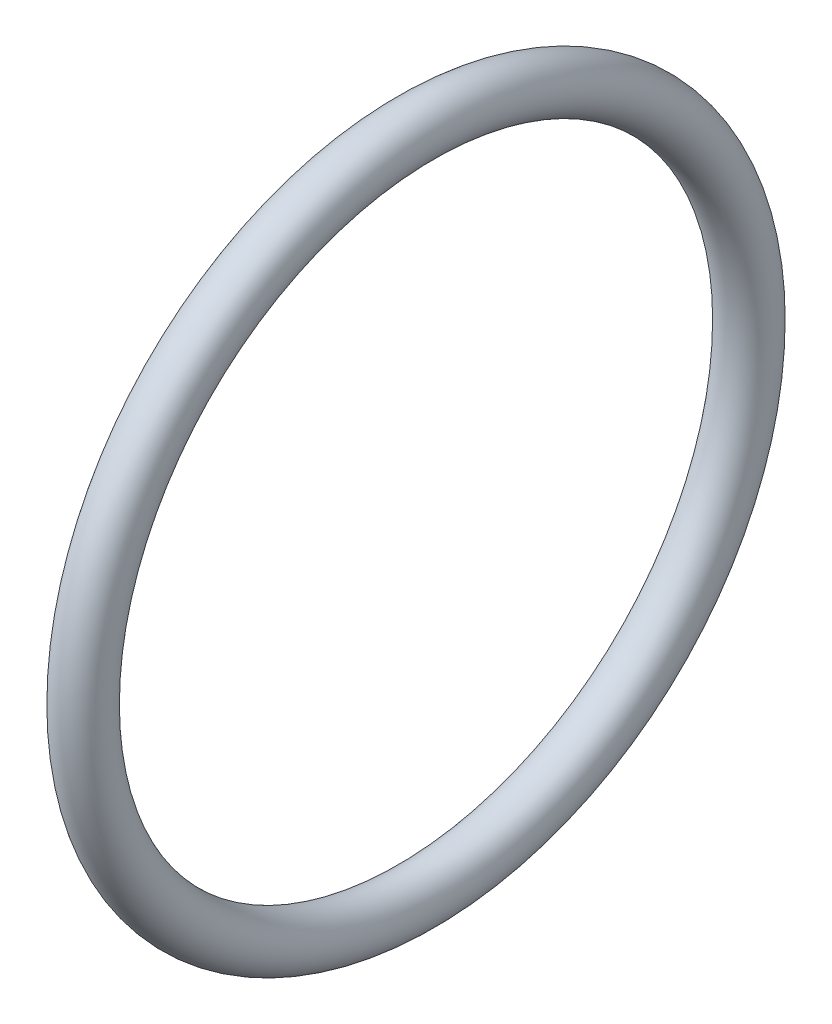
ISO-10303-21;
HEADER;
FILE_DESCRIPTION(('STEP AP214'),'2;1');
FILE_NAME('part.step','',(''),(''),'','','');
FILE_SCHEMA(('AUTOMOTIVE_DESIGN { 1 0 10303 214 1 1 1 1 }'));
ENDSEC;
DATA;
#1=APPLICATION_CONTEXT('core data for automotive mechanical design processes');
#2=APPLICATION_PROTOCOL_DEFINITION('international standard','automotive_design',2000,#1);
#3=PRODUCT_CONTEXT('',#1,'mechanical');
#4=PRODUCT('Part','Part','',(#3));
#5=PRODUCT_RELATED_PRODUCT_CATEGORY('part','',(#4));
#6=PRODUCT_DEFINITION_FORMATION('','',#4);
#7=PRODUCT_DEFINITION_CONTEXT('part definition',#1,'design');
#8=PRODUCT_DEFINITION('design','',#6,#7);
#9=PRODUCT_DEFINITION_SHAPE('','',#8);
#10=(LENGTH_UNIT() NAMED_UNIT(*) SI_UNIT(.MILLI.,.METRE.));
#11=(NAMED_UNIT(*) PLANE_ANGLE_UNIT() SI_UNIT($,.RADIAN.));
#12=(NAMED_UNIT(*) SI_UNIT($,.STERADIAN.) SOLID_ANGLE_UNIT());
#13=UNCERTAINTY_MEASURE_WITH_UNIT(LENGTH_MEASURE(1.E-05),#10,'distance_accuracy_value','');
#14=(GEOMETRIC_REPRESENTATION_CONTEXT(3) GLOBAL_UNCERTAINTY_ASSIGNED_CONTEXT((#13)) GLOBAL_UNIT_ASSIGNED_CONTEXT((#10,
#11,#12)) REPRESENTATION_CONTEXT('',''));
#15=CARTESIAN_POINT('',(0.,0.,0.));
#16=DIRECTION('',(0.,0.,1.));
#17=DIRECTION('',(1.,0.,0.));
#18=AXIS2_PLACEMENT_3D('',#15,#16,#17);
#19=CARTESIAN_POINT('',(0.,0.,0.));
#20=DIRECTION('',(1.,0.,0.));
#21=DIRECTION('',(0.,0.,1.));
#22=AXIS2_PLACEMENT_3D('',#19,#20,#21);
#23=TOROIDAL_SURFACE('',#22,23.025,1.775);
#24=CARTESIAN_POINT('',(0.,0.,24.8));
#25=VERTEX_POINT('',#24);
#26=VERTEX_LOOP('',#25);
#27=FACE_BOUND('',#26,.T.);
#28=ADVANCED_FACE('F49',(#27),#23,.T.);
#29=CLOSED_SHELL('',(#28));
#30=MANIFOLD_SOLID_BREP('B2',#29);
#31=ADVANCED_BREP_SHAPE_REPRESENTATION('',(#18,#30),#14);
#32=SHAPE_DEFINITION_REPRESENTATION(#9,#31);
ENDSEC;
END-ISO-10303-21;
